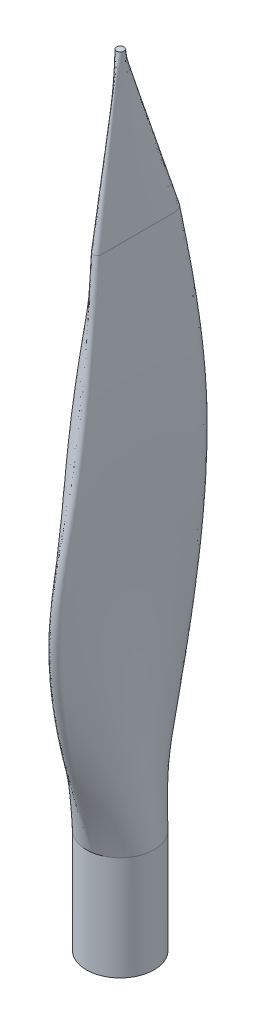
ISO-10303-21;
HEADER;
FILE_DESCRIPTION(('STEP AP214'),'2;1');
FILE_NAME('part.step','',(''),(''),'','','');
FILE_SCHEMA(('AUTOMOTIVE_DESIGN { 1 0 10303 214 1 1 1 1 }'));
ENDSEC;
DATA;
#1=APPLICATION_CONTEXT('core data for automotive mechanical design processes');
#2=APPLICATION_PROTOCOL_DEFINITION('international standard','automotive_design',2000,#1);
#3=PRODUCT_CONTEXT('',#1,'mechanical');
#4=PRODUCT('Part','Part','',(#3));
#5=PRODUCT_RELATED_PRODUCT_CATEGORY('part','',(#4));
#6=PRODUCT_DEFINITION_FORMATION('','',#4);
#7=PRODUCT_DEFINITION_CONTEXT('part definition',#1,'design');
#8=PRODUCT_DEFINITION('design','',#6,#7);
#9=PRODUCT_DEFINITION_SHAPE('','',#8);
#10=(LENGTH_UNIT() NAMED_UNIT(*) SI_UNIT(.MILLI.,.METRE.));
#11=(NAMED_UNIT(*) PLANE_ANGLE_UNIT() SI_UNIT($,.RADIAN.));
#12=(NAMED_UNIT(*) SI_UNIT($,.STERADIAN.) SOLID_ANGLE_UNIT());
#13=UNCERTAINTY_MEASURE_WITH_UNIT(LENGTH_MEASURE(1.E-05),#10,'distance_accuracy_value','');
#14=(GEOMETRIC_REPRESENTATION_CONTEXT(3) GLOBAL_UNCERTAINTY_ASSIGNED_CONTEXT((#13)) GLOBAL_UNIT_ASSIGNED_CONTEXT((#10,
#11,#12)) REPRESENTATION_CONTEXT('',''));
#15=CARTESIAN_POINT('',(0.,0.,0.));
#16=DIRECTION('',(0.,0.,1.));
#17=DIRECTION('',(1.,0.,0.));
#18=AXIS2_PLACEMENT_3D('',#15,#16,#17);
#19=CARTESIAN_POINT('',(0.,25.4,0.));
#20=DIRECTION('',(0.,-1.,0.));
#21=DIRECTION('',(0.,0.,-1.));
#22=AXIS2_PLACEMENT_3D('',#19,#20,#21);
#23=CYLINDRICAL_SURFACE('',#22,8.255);
#24=CARTESIAN_POINT('',(1.80932759033106,25.4,8.05427580052154));
#25=CARTESIAN_POINT('',(2.67978327745344,25.4,7.8587350057359));
#26=CARTESIAN_POINT('',(4.40405834460332,25.4,7.17162650027965));
#27=CARTESIAN_POINT('',(6.58489006832294,25.4,5.25830001659392));
#28=CARTESIAN_POINT('',(8.00372189128558,25.4000000000001,2.65049159237982));
#29=CARTESIAN_POINT('',(8.42313117362764,25.4,-0.295611690758836));
#30=CARTESIAN_POINT('',(7.80713114017676,25.4,-3.14992232382668));
#31=CARTESIAN_POINT('',(6.32180910962537,25.4000000000001,-5.53839029307543));
#32=CARTESIAN_POINT('',(4.25377745083092,25.4,-7.23025019439572));
#33=CARTESIAN_POINT('',(2.69386288098785,25.4,-7.84431519435912));
#34=CARTESIAN_POINT('',(1.58775194501462,25.4,-8.10774402425285));
#35=CARTESIAN_POINT('',(1.09992054255627,25.4,-8.18917968355147));
#36=CARTESIAN_POINT('',(0.470027936961688,25.4,-8.2493608472894));
#37=CARTESIAN_POINT('',(-0.0955518176870434,25.4,-8.2600571099097));
#38=CARTESIAN_POINT('',(-0.640696145279333,25.4,-8.23646633300742));
#39=CARTESIAN_POINT('',(-1.18150648601451,25.4,-8.17567725579651));
#40=CARTESIAN_POINT('',(-1.73657154658257,25.4,-8.0781106803358));
#41=CARTESIAN_POINT('',(-2.34286105201328,25.4,-7.92358184713654));
#42=CARTESIAN_POINT('',(-2.80555345530794,25.4,-7.77018667396729));
#43=CARTESIAN_POINT('',(-3.90348423058681,25.4,-7.32508809915818));
#44=CARTESIAN_POINT('',(-5.45022553650636,25.4,-6.40186993791091));
#45=CARTESIAN_POINT('',(-7.28377189256357,25.4000000000001,-4.22915798099006));
#46=CARTESIAN_POINT('',(-8.30980464907361,25.4,-1.44766247676574));
#47=CARTESIAN_POINT('',(-8.28896624779018,25.4,1.60724893357077));
#48=CARTESIAN_POINT('',(-7.15199149312844,25.4,4.49216296709132));
#49=CARTESIAN_POINT('',(-5.05070886586144,25.4,6.76443468651455));
#50=CARTESIAN_POINT('',(-2.32382514841782,25.4,8.10606055182153));
#51=CARTESIAN_POINT('',(-0.373664870378359,25.4,8.30049478477802));
#52=CARTESIAN_POINT('',(0.648006449935642,25.4,8.22990815233184));
#53=CARTESIAN_POINT('',(0.775179727804014,25.4,8.21938942196944));
#54=CARTESIAN_POINT('',(0.916855966516563,25.4,8.20393176763898));
#55=CARTESIAN_POINT('',(1.05302505401393,25.4,8.18791038456564));
#56=CARTESIAN_POINT('',(1.18696385329334,25.4,8.16996413029657));
#57=CARTESIAN_POINT('',(1.32194922735204,25.4,8.14873186237891));
#58=CARTESIAN_POINT('',(1.45871837180815,25.4,8.12508149695626));
#59=CARTESIAN_POINT('',(1.59800848227982,25.4,8.0998809501722));
#60=CARTESIAN_POINT('',(1.7270931355389,25.4,8.07274910236415));
#61=CARTESIAN_POINT('',(1.80932759033106,25.4,8.05427580052154));
#62=B_SPLINE_CURVE_WITH_KNOTS('',3,(#24,#25,#26,#27,#28,#29,#30,#31,#32,#33,#34,#35,#36,#37,#38,
#39,#40,#41,#42,#43,#44,#45,#46,#47,#48,#49,#50,#51,#52,#53,#54,#55,#56,#57,#58,#59,#60,#61),
.UNSPECIFIED.,.T.,.F.,(4,1,1,1,1,1,1,1,2,1,1,1,1,1,1,1,2,1,1,1,1,1,1,1,2,1,1,1,1,1,1,1,4),(0.,
0.0474035656567812,0.0948071313135626,0.142210696970344,0.189614262627125,0.237017828283906,
0.284421393940688,0.331824959597469,0.37922852525425,0.398930454165107,0.418632383075965,
0.438334311986822,0.458036240897679,0.477738169808536,0.497440098719393,0.517142027630251,
0.536843956541108,0.590260110651673,0.643676264762238,0.697092418872803,0.750508572983368,
0.803924727093933,0.857340881204498,0.910757035315063,0.964173189425628,0.968651540747424,
0.973129892069221,0.977608243391017,0.982086594712814,0.98656494603461,0.991043297356407,
0.995521648678203,1.),.UNSPECIFIED.);
#63=CARTESIAN_POINT('',(1.80932759033106,25.4,8.05427580052154));
#64=VERTEX_POINT('',#63);
#65=EDGE_CURVE('E12',#64,#64,#62,.T.);
#66=ORIENTED_EDGE('',*,*,#65,.F.);
#67=EDGE_LOOP('',(#66));
#68=FACE_BOUND('',#67,.T.);
#69=CARTESIAN_POINT('',(0.,0.,0.));
#70=DIRECTION('',(0.,1.,0.));
#71=DIRECTION('',(0.,0.,1.));
#72=AXIS2_PLACEMENT_3D('',#69,#70,#71);
#73=CIRCLE('',#72,8.255);
#74=CARTESIAN_POINT('',(0.,0.,8.255));
#75=VERTEX_POINT('',#74);
#76=EDGE_CURVE('E337',#75,#75,#73,.T.);
#77=ORIENTED_EDGE('',*,*,#76,.T.);
#78=EDGE_LOOP('',(#77));
#79=FACE_BOUND('',#78,.T.);
#80=ADVANCED_FACE('F327',(#68,#79),#23,.T.);
#81=CARTESIAN_POINT('',(0.,0.,0.));
#82=DIRECTION('',(0.,1.,0.));
#83=DIRECTION('',(0.,0.,1.));
#84=AXIS2_PLACEMENT_3D('',#81,#82,#83);
#85=PLANE('',#84);
#86=ORIENTED_EDGE('',*,*,#76,.F.);
#87=EDGE_LOOP('',(#86));
#88=FACE_BOUND('',#87,.T.);
#89=ADVANCED_FACE('F501',(#88),#85,.F.);
#90=CARTESIAN_POINT('',(3.048,152.4,7.61999999940538));
#91=CARTESIAN_POINT('',(3.97168311158025,137.581726372762,9.93705083523815));
#92=CARTESIAN_POINT('',(5.23320858694252,114.308696250823,12.8048771780018));
#93=CARTESIAN_POINT('',(5.29375091884643,71.9261980239934,23.1651337174881));
#94=CARTESIAN_POINT('',(3.22772954592855,44.2663637223632,13.8288904179118));
#95=CARTESIAN_POINT('',(1.80932759033106,25.4,8.05427580052153));
#96=CARTESIAN_POINT('',(3.048,152.4,7.69377822315741));
#97=CARTESIAN_POINT('',(3.96966035013993,137.581354953724,10.0174954248009));
#98=CARTESIAN_POINT('',(5.2299981479001,114.308520378345,12.9103197773176));
#99=CARTESIAN_POINT('',(5.30425883549053,71.9269283631706,23.309867095451));
#100=CARTESIAN_POINT('',(3.17223412179021,44.2623501151557,13.900336943178));
#101=CARTESIAN_POINT('',(1.7270931355389,25.4,8.07274910236414));
#102=CARTESIAN_POINT('',(3.03284996543065,152.4,7.85713540246196));
#103=CARTESIAN_POINT('',(3.94980473586425,137.580424250727,10.1916731634053));
#104=CARTESIAN_POINT('',(5.19242077040421,114.308202626544,13.059654404207));
#105=CARTESIAN_POINT('',(5.27130855208229,71.9284020126512,23.641442136659));
#106=CARTESIAN_POINT('',(3.09379141282416,44.2541287434281,14.0357445660036));
#107=CARTESIAN_POINT('',(1.59800848227982,25.4,8.09988095017219));
#108=CARTESIAN_POINT('',(2.91482044007338,152.4,8.1701434534786));
#109=CARTESIAN_POINT('',(3.84811678752602,137.574548273565,10.4405257545582));
#110=CARTESIAN_POINT('',(5.1217706733076,114.308996227939,13.2031925918432));
#111=CARTESIAN_POINT('',(5.04580682921654,71.9295893732187,24.1384042981667));
#112=CARTESIAN_POINT('',(2.9199153566371,44.2440298039645,14.2351544480443));
#113=CARTESIAN_POINT('',(1.45871837180815,25.4,8.12508149695625));
#114=CARTESIAN_POINT('',(2.62862325932065,152.4,8.47885349666639));
#115=CARTESIAN_POINT('',(3.65112604535391,137.570023716306,10.6753157842188));
#116=CARTESIAN_POINT('',(5.06882507037544,114.309662921156,13.3070719799318));
#117=CARTESIAN_POINT('',(4.63052156853944,71.930342428506,24.5498224427027));
#118=CARTESIAN_POINT('',(2.6892531645742,44.2370839575759,14.3977832191952));
#119=CARTESIAN_POINT('',(1.32194922735204,25.4,8.1487318623789));
#120=CARTESIAN_POINT('',(2.24956561164877,152.4,8.63814160058633));
#121=CARTESIAN_POINT('',(3.39647581626578,137.569755557536,10.8180126637516));
#122=CARTESIAN_POINT('',(5.01759359345515,114.309518661417,13.4172176537514));
#123=CARTESIAN_POINT('',(4.09049431209239,71.930919824789,24.8014527218704));
#124=CARTESIAN_POINT('',(2.41438563472446,44.2339281258207,14.5048338888274));
#125=CARTESIAN_POINT('',(1.18696385329334,25.4,8.16996413029656));
#126=CARTESIAN_POINT('',(1.83666604137124,152.4,8.64753152033097));
#127=CARTESIAN_POINT('',(3.11286857078359,137.574470745827,10.8756429530747));
#128=CARTESIAN_POINT('',(4.94594521116449,114.308414213725,13.5477482415983));
#129=CARTESIAN_POINT('',(3.49229466016987,71.9313226757487,24.8362419318372));
#130=CARTESIAN_POINT('',(2.11860641714705,44.2350493393417,14.5346278331545));
#131=CARTESIAN_POINT('',(1.05302505401393,25.4,8.18791038456563));
#132=CARTESIAN_POINT('',(1.45248946922749,152.4,8.48250238118353));
#133=CARTESIAN_POINT('',(2.82467126814199,137.583514566891,10.828094571973));
#134=CARTESIAN_POINT('',(4.82295430109227,114.306469732402,13.6928522491202));
#135=CARTESIAN_POINT('',(2.92538656147474,71.9315912946591,24.6649364072667));
#136=CARTESIAN_POINT('',(1.83220688582505,44.2397961496228,14.4924496026579));
#137=CARTESIAN_POINT('',(0.916855966516562,25.4,8.20393176763897));
#138=CARTESIAN_POINT('',(1.22795290414053,152.4,8.25809092741003));
#139=CARTESIAN_POINT('',(2.60042228763511,137.593319302182,10.7380058079384));
#140=CARTESIAN_POINT('',(4.59867015678572,114.304528127488,13.8070149178152));
#141=CARTESIAN_POINT('',(2.49098291387786,71.9313998881605,24.3188582473986));
#142=CARTESIAN_POINT('',(1.57452749469113,44.2474282542082,14.3855426456171));
#143=CARTESIAN_POINT('',(0.775179727804013,25.4,8.21938942196943));
#144=CARTESIAN_POINT('',(1.14805065787373,152.4,8.12570038874196));
#145=CARTESIAN_POINT('',(2.45119534217352,137.596233346646,10.6440185301182));
#146=CARTESIAN_POINT('',(4.3788379823412,114.304218957689,13.8252949399085));
#147=CARTESIAN_POINT('',(2.31630542948646,71.9305663760588,24.0235764561422));
#148=CARTESIAN_POINT('',(1.44159343462687,44.2536968213726,14.2885131525573));
#149=CARTESIAN_POINT('',(0.648006449935641,25.4,8.22990815233183));
#150=CARTESIAN_POINT('',(0.75570198256734,152.4,7.31607262472453));
#151=CARTESIAN_POINT('',(1.5977964825883,137.613311927929,10.0559615996452));
#152=CARTESIAN_POINT('',(2.53350237362381,114.302612672437,13.2855252745979));
#153=CARTESIAN_POINT('',(1.8016061664488,71.9250850346128,22.2529443718681));
#154=CARTESIAN_POINT('',(0.406365657089637,44.293507001201,13.6706499573457));
#155=CARTESIAN_POINT('',(-0.37366487037836,25.4,8.30049478477801));
#156=CARTESIAN_POINT('',(0.0946718340403648,152.4,5.84071096795229));
#157=CARTESIAN_POINT('',(-0.198988633256508,137.606149317206,8.40265708666957));
#158=CARTESIAN_POINT('',(-0.636916623976693,114.308279433511,11.9658553563863));
#159=CARTESIAN_POINT('',(0.88596064562425,71.91290867965,19.0449697522357));
#160=CARTESIAN_POINT('',(-1.04760951232219,44.3513698674302,12.3537848753321));
#161=CARTESIAN_POINT('',(-2.32382514841782,25.4,8.10606055182152));
#162=CARTESIAN_POINT('',(-0.735600151006803,152.4,3.65704382737677));
#163=CARTESIAN_POINT('',(-2.26317954169824,137.611314262259,5.83435974280122));
#164=CARTESIAN_POINT('',(-4.77697083809689,114.309998453016,8.7405354012308));
#165=CARTESIAN_POINT('',(-0.0940885118817747,71.9048592119292,14.6178824220131));
#166=CARTESIAN_POINT('',(-3.32089999272538,44.3963322387879,9.80296756401438));
#167=CARTESIAN_POINT('',(-5.05070886586145,25.4,6.76443468651454));
#168=CARTESIAN_POINT('',(-1.43222965159674,152.4,1.47621174363645));
#169=CARTESIAN_POINT('',(-3.92758699487259,137.605211764494,2.81630991313687));
#170=CARTESIAN_POINT('',(-7.90376941336725,114.313256641385,4.58482948624845));
#171=CARTESIAN_POINT('',(-0.981587325798548,71.8990361064457,10.4542130132672));
#172=CARTESIAN_POINT('',(-5.03329632971325,44.422189329106,6.74260672415038));
#173=CARTESIAN_POINT('',(-7.15199149312844,25.4,4.49216296709132));
#174=CARTESIAN_POINT('',(-2.00305474042763,152.4,-0.721521693234956));
#175=CARTESIAN_POINT('',(-5.02920671646798,137.602529535906,-0.444386453288144));
#176=CARTESIAN_POINT('',(-9.82483231968892,114.315411249088,-0.245714495655292));
#177=CARTESIAN_POINT('',(-1.86781297568134,71.8943820158215,6.4442139183333));
#178=CARTESIAN_POINT('',(-6.1350755744243,44.444343498632,3.33428769140196));
#179=CARTESIAN_POINT('',(-8.28896624779018,25.4,1.60724893357077));
#180=CARTESIAN_POINT('',(-2.45591349019765,152.4,-2.95589289320372));
#181=CARTESIAN_POINT('',(-5.54333303088181,137.604934449843,-3.86146856883915));
#182=CARTESIAN_POINT('',(-10.3937444229804,114.316483945471,-5.4058883509224));
#183=CARTESIAN_POINT('',(-2.82961493017938,71.8898446464626,2.42121622385264));
#184=CARTESIAN_POINT('',(-6.51480780231193,44.4693448130502,-0.199031875958989));
#185=CARTESIAN_POINT('',(-8.30980464907361,25.4,-1.44766247676575));
#186=CARTESIAN_POINT('',(-2.78971411525367,152.4,-5.25005144935452));
#187=CARTESIAN_POINT('',(-5.44771727186078,137.615451843705,-7.31334176461919));
#188=CARTESIAN_POINT('',(-9.57650518697891,114.315335250767,-10.5308333323564));
#189=CARTESIAN_POINT('',(-3.84999992758616,71.8869315216877,-1.79235963711607));
#190=CARTESIAN_POINT('',(-6.23819399534766,44.4914790516474,-3.63092684978925));
#191=CARTESIAN_POINT('',(-7.28377189256358,25.4000000000001,-4.22915798099006));
#192=CARTESIAN_POINT('',(-3.00336482994257,152.4,-7.62714695477207));
#193=CARTESIAN_POINT('',(-4.76108272341757,137.632634638331,-10.6446714565224));
#194=CARTESIAN_POINT('',(-7.4295347268096,114.311287170924,-15.2719768949814));
#195=CARTESIAN_POINT('',(-4.86872603218884,71.8884671731651,-6.35190158898583));
#196=CARTESIAN_POINT('',(-5.34375212967183,44.4952166762149,-6.82070309230426));
#197=CARTESIAN_POINT('',(-5.45022553650636,25.3999999999999,-6.40186993791091));
#198=CARTESIAN_POINT('',(-3.05327670738949,152.4,-9.29892266146442));
#199=CARTESIAN_POINT('',(-3.9456985600277,137.649243774194,-12.8073310063237));
#200=CARTESIAN_POINT('',(-5.22822295373281,114.305694944083,-17.9335853372936));
#201=CARTESIAN_POINT('',(-5.41482349170166,71.8948198951098,-9.73017204455028));
#202=CARTESIAN_POINT('',(-4.62976602332054,44.4737536278063,-8.68022312697193));
#203=CARTESIAN_POINT('',(-3.90348423058681,25.4,-7.32508809915818));
#204=CARTESIAN_POINT('',(-3.05152453620632,152.4,-10.483772367863));
#205=CARTESIAN_POINT('',(-3.27402898321782,137.657946878989,-14.1382754882184));
#206=CARTESIAN_POINT('',(-3.4960288170403,114.301643686965,-19.5552285284041));
#207=CARTESIAN_POINT('',(-5.74954917163259,71.9013983895992,-12.1508049254121));
#208=CARTESIAN_POINT('',(-3.88288251665887,44.445768511333,-9.92534773725531));
#209=CARTESIAN_POINT('',(-2.80555345530794,25.4,-7.77018667396728));
#210=CARTESIAN_POINT('',(-2.95017481811556,152.4,-11.1593386625729));
#211=CARTESIAN_POINT('',(-2.79621313675327,137.66210742133,-14.8548318047083));
#212=CARTESIAN_POINT('',(-2.43436449053018,114.299415944983,-20.2312814314484));
#213=CARTESIAN_POINT('',(-5.65599457656074,71.9053869568694,-13.5643289645063));
#214=CARTESIAN_POINT('',(-3.56586005185774,44.4280444110888,-10.5415273980723));
#215=CARTESIAN_POINT('',(-2.34286105201327,25.4,-7.92358184713654));
#216=CARTESIAN_POINT('',(-2.40027227789121,152.4,-12.1689652599414));
#217=CARTESIAN_POINT('',(-1.7588966365161,137.660474810592,-15.64213952803));
#218=CARTESIAN_POINT('',(-0.675676917175755,114.2978061786,-20.6342095831424));
#219=CARTESIAN_POINT('',(-4.64337055234337,71.9110228653062,-15.6053086070999));
#220=CARTESIAN_POINT('',(-2.73256231181346,44.3979082416063,-11.3848396653549));
#221=CARTESIAN_POINT('',(-1.73657154658257,25.4,-8.07811068033579));
#222=CARTESIAN_POINT('',(-1.40925413849907,152.4,-12.9716188458783));
#223=CARTESIAN_POINT('',(-0.473725574125652,137.653674726298,-16.0804050352248));
#224=CARTESIAN_POINT('',(1.0060895718526,114.297794759591,-20.4603168179556));
#225=CARTESIAN_POINT('',(-2.78571404422093,71.9150925701258,-17.1350558863766));
#226=CARTESIAN_POINT('',(-1.65767590605836,44.3723364824152,-11.9751279368341));
#227=CARTESIAN_POINT('',(-1.18150648601451,25.4,-8.17567725579651));
#228=CARTESIAN_POINT('',(-0.0830069687557917,152.4,-13.3120549401497));
#229=CARTESIAN_POINT('',(0.929992411086743,137.644754945545,-16.0488317600551));
#230=CARTESIAN_POINT('',(2.45805168273842,114.29909068241,-19.8445850939073));
#231=CARTESIAN_POINT('',(-0.396708442770806,71.9166305152768,-17.7586801256953));
#232=CARTESIAN_POINT('',(-0.40898846805068,44.3583684855525,-12.2017728761663));
#233=CARTESIAN_POINT('',(-0.640696145279333,25.4,-8.23646633300742));
#234=CARTESIAN_POINT('',(1.27787244373007,152.4,-13.0374117612226));
#235=CARTESIAN_POINT('',(2.24171512653679,137.637171238719,-15.5115405469324));
#236=CARTESIAN_POINT('',(3.62478968857768,114.301074053256,-18.9244823226268));
#237=CARTESIAN_POINT('',(2.02438530249383,71.9153824151871,-17.3099835972212));
#238=CARTESIAN_POINT('',(0.839739404906433,44.3596565449877,-12.0112193293873));
#239=CARTESIAN_POINT('',(-0.0955518176870446,25.4,-8.2600571099097));
#240=CARTESIAN_POINT('',(2.33744279846333,152.4,-12.2475765459533));
#241=CARTESIAN_POINT('',(3.24968365168173,137.631166979922,-14.5631837140983));
#242=CARTESIAN_POINT('',(4.50249461536489,114.303604801568,-17.7867318735303));
#243=CARTESIAN_POINT('',(3.97385394847938,71.9116098703233,-15.9291999325312));
#244=CARTESIAN_POINT('',(1.91360212223259,44.3750181792033,-11.4607291073964));
#245=CARTESIAN_POINT('',(0.470027936961686,25.4,-8.2493608472894));
#246=CARTESIAN_POINT('',(2.93752052811045,152.4,-11.203552835));
#247=CARTESIAN_POINT('',(3.84912741814383,137.624981547665,-13.3877879326911));
#248=CARTESIAN_POINT('',(5.07645100809808,114.306740038929,-16.4760556890908));
#249=CARTESIAN_POINT('',(5.12329447000906,71.9061924352489,-13.9852895101014));
#250=CARTESIAN_POINT('',(2.75402689252717,44.3987295206361,-10.6652675740491));
#251=CARTESIAN_POINT('',(1.09992054255627,25.4,-8.18917968355146));
#252=CARTESIAN_POINT('',(3.04799999999999,152.4,-10.4946673952408));
#253=CARTESIAN_POINT('',(3.96814228422362,137.619689611612,-12.5587000660699));
#254=CARTESIAN_POINT('',(5.22387079179835,114.309265509483,-15.526034233405));
#255=CARTESIAN_POINT('',(5.32292341271784,71.9020123486266,-12.5918167379491));
#256=CARTESIAN_POINT('',(3.07506740041793,44.4166731777878,-10.0834331849082));
#257=CARTESIAN_POINT('',(1.58775194501462,25.4,-8.10774402425285));
#258=CARTESIAN_POINT('',(3.048,152.4,-9.35477793053567));
#259=CARTESIAN_POINT('',(3.97670590895846,137.610579793457,-11.2006698250624));
#260=CARTESIAN_POINT('',(5.27126076900692,114.313291457218,-13.8821104054559));
#261=CARTESIAN_POINT('',(5.18045461638699,71.8957486562709,-10.346707680953));
#262=CARTESIAN_POINT('',(3.81470200530043,44.4427611148985,-9.01908424950873));
#263=CARTESIAN_POINT('',(2.69386288098784,25.4,-7.84431519435912));
#264=CARTESIAN_POINT('',(3.048,152.4,-7.79232136319472));
#265=CARTESIAN_POINT('',(3.96850319323532,137.597377764932,-9.28435720629213));
#266=CARTESIAN_POINT('',(5.32433992571476,114.318044632025,-11.5551919548377));
#267=CARTESIAN_POINT('',(5.03144534696487,71.8898058836629,-7.2371639325686));
#268=CARTESIAN_POINT('',(4.57666016686645,44.4644221229193,-7.44774753422817));
#269=CARTESIAN_POINT('',(4.25377745083092,25.4,-7.23025019439572));
#270=CARTESIAN_POINT('',(3.048,152.4,-5.54898175825335));
#271=CARTESIAN_POINT('',(3.97242097440411,137.581898270615,-6.48957736337003));
#272=CARTESIAN_POINT('',(5.40463926390504,114.321538948277,-8.02490491602116));
#273=CARTESIAN_POINT('',(4.79632888707788,71.8888645170624,-2.77783847103991));
#274=CARTESIAN_POINT('',(5.79035606274939,44.4587780435224,-4.64837440836168));
#275=CARTESIAN_POINT('',(6.32180910962537,25.4000000000001,-5.53839029307543));
#276=CARTESIAN_POINT('',(3.048,152.4,-3.36236993068896));
#277=CARTESIAN_POINT('',(3.97174489723188,137.571117062234,-3.72786082037402));
#278=CARTESIAN_POINT('',(5.46007994059228,114.3230411201,-4.47962066744949));
#279=CARTESIAN_POINT('',(4.63600559091762,71.8909095013137,1.53765457110411));
#280=CARTESIAN_POINT('',(6.61569260864911,44.4409366033177,-1.49343722052648));
#281=CARTESIAN_POINT('',(7.80713114017677,25.4,-3.14992232382668));
#282=CARTESIAN_POINT('',(3.048,152.4,-1.20735642444523));
#283=CARTESIAN_POINT('',(3.97239332326998,137.565718628521,-0.992580151031468));
#284=CARTESIAN_POINT('',(5.48353670760537,114.323405257906,-0.933327926341549));
#285=CARTESIAN_POINT('',(4.56761862204077,71.8930584183455,5.76037339683394));
#286=CARTESIAN_POINT('',(6.96838042849166,44.4262085753047,1.91119088619829));
#287=CARTESIAN_POINT('',(8.42313117362764,25.4,-0.295611690758839));
#288=CARTESIAN_POINT('',(3.048,152.4,0.941188216534154));
#289=CARTESIAN_POINT('',(3.97143885992435,137.564984821815,1.72509029980058));
#290=CARTESIAN_POINT('',(5.46761777618148,114.323120598389,2.59297547526469));
#291=CARTESIAN_POINT('',(4.61433478682965,71.8943192523562,9.96039100709258));
#292=CARTESIAN_POINT('',(6.72710735255327,44.4192168430985,5.36318524240165));
#293=CARTESIAN_POINT('',(8.00372189128558,25.4,2.65049159237982));
#294=CARTESIAN_POINT('',(3.048,152.4,3.10734764091662));
#295=CARTESIAN_POINT('',(3.97471782636461,137.569553075931,4.45523803754671));
#296=CARTESIAN_POINT('',(5.41417833500179,114.321267754573,6.07051113212648));
#297=CARTESIAN_POINT('',(4.76731132331026,71.8969789536903,14.2162964406797));
#298=CARTESIAN_POINT('',(5.94137695560907,44.4086138489268,8.62074251585487));
#299=CARTESIAN_POINT('',(6.58489006832294,25.4,5.25830001659392));
#300=CARTESIAN_POINT('',(3.048,152.4,5.31520549736959));
#301=CARTESIAN_POINT('',(3.96196128284185,137.572471841739,7.13909296569572));
#302=CARTESIAN_POINT('',(5.33126228666825,114.318089810452,9.49828696062326));
#303=CARTESIAN_POINT('',(5.01526050621042,71.9044593244198,18.5788719326305));
#304=CARTESIAN_POINT('',(4.65559072751634,44.3720623860605,11.5250542098185));
#305=CARTESIAN_POINT('',(4.40405834460332,25.4,7.17162650027965));
#306=CARTESIAN_POINT('',(3.048,152.4,6.83905392743283));
#307=CARTESIAN_POINT('',(3.99309413940145,137.585657861269,9.08554095826342));
#308=CARTESIAN_POINT('',(5.26719123970893,114.310557869521,11.6887621569761));
#309=CARTESIAN_POINT('',(5.18252411220219,71.9184673484276,21.6331239013755));
#310=CARTESIAN_POINT('',(3.81515129843581,44.3088479490599,13.0726254873515));
#311=CARTESIAN_POINT('',(2.67978327745344,25.4,7.8587350057359));
#312=CARTESIAN_POINT('',(3.048,152.4,7.61999999940538));
#313=CARTESIAN_POINT('',(3.97168311158025,137.581726372762,9.93705083523815));
#314=CARTESIAN_POINT('',(5.23320858694252,114.308696250823,12.8048771780018));
#315=CARTESIAN_POINT('',(5.29375091884643,71.9261980239934,23.1651337174881));
#316=CARTESIAN_POINT('',(3.22772954592855,44.2663637223632,13.8288904179118));
#317=CARTESIAN_POINT('',(1.80932759033106,25.4,8.05427580052153));
#318=B_SPLINE_SURFACE_WITH_KNOTS('',3,3,((#90,#91,#92,#93,#94,#95),(#96,#97,#98,#99,#100,#101),
(#102,#103,#104,#105,#106,#107),(#108,#109,#110,#111,#112,#113),(#114,#115,#116,#117,#118,#119),
(#120,#121,#122,#123,#124,#125),(#126,#127,#128,#129,#130,#131),(#132,#133,#134,#135,#136,#137),
(#138,#139,#140,#141,#142,#143),(#144,#145,#146,#147,#148,#149),(#150,#151,#152,#153,#154,#155),
(#156,#157,#158,#159,#160,#161),(#162,#163,#164,#165,#166,#167),(#168,#169,#170,#171,#172,#173),
(#174,#175,#176,#177,#178,#179),(#180,#181,#182,#183,#184,#185),(#186,#187,#188,#189,#190,#191),
(#192,#193,#194,#195,#196,#197),(#198,#199,#200,#201,#202,#203),(#204,#205,#206,#207,#208,#209),
(#210,#211,#212,#213,#214,#215),(#216,#217,#218,#219,#220,#221),(#222,#223,#224,#225,#226,#227),
(#228,#229,#230,#231,#232,#233),(#234,#235,#236,#237,#238,#239),(#240,#241,#242,#243,#244,#245),
(#246,#247,#248,#249,#250,#251),(#252,#253,#254,#255,#256,#257),(#258,#259,#260,#261,#262,#263),
(#264,#265,#266,#267,#268,#269),(#270,#271,#272,#273,#274,#275),(#276,#277,#278,#279,#280,#281),
(#282,#283,#284,#285,#286,#287),(#288,#289,#290,#291,#292,#293),(#294,#295,#296,#297,#298,#299),
(#300,#301,#302,#303,#304,#305),(#306,#307,#308,#309,#310,#311),(#312,#313,#314,#315,#316,
#317)),.UNSPECIFIED.,.T.,.F.,.F.,(4,1,1,1,1,1,1,1,2,1,1,1,1,1,1,1,2,1,1,1,1,1,1,1,2,1,1,1,1,1,1,
1,4),(4,1,1,4),(0.,0.00447835132179653,0.00895670264359306,0.0134350539653896,
0.0179134052871861,0.0223917566089827,0.0268701079307792,0.0313484592525757,0.0358268105743723,
0.0892429646849372,0.142659118795502,0.196075272906067,0.249491427016632,0.302907581127197,
0.356323735237762,0.409739889348327,0.463156043458892,0.482857972369749,0.502559901280607,
0.522261830191464,0.541963759102321,0.561665688013178,0.581367616924035,0.601069545834893,
0.62077147474575,0.668175040402531,0.715578606059312,0.762982171716094,0.810385737372875,
0.857789303029656,0.905192868686437,0.952596434343219,1.),(0.,0.349700606480374,
0.549408268412602,1.),.UNSPECIFIED.);
#319=CARTESIAN_POINT('',(2.032,152.4,7.62));
#320=DIRECTION('',(0.,1.,0.));
#321=DIRECTION('',(0.,0.,-1.));
#322=AXIS2_PLACEMENT_3D('',#319,#320,#321);
#323=CIRCLE('',#322,1.016);
#324=CARTESIAN_POINT('',(1.11770105533342,152.4,8.06307272516098));
#325=VERTEX_POINT('',#324);
#326=CARTESIAN_POINT('',(3.048,152.4,7.62));
#327=VERTEX_POINT('',#326);
#328=EDGE_CURVE('E350',#325,#327,#323,.T.);
#329=CARTESIAN_POINT('',(38.6039577865707,152.4,-10.1029090066302));
#330=DIRECTION('',(0.,1.,0.));
#331=DIRECTION('',(0.,0.,1.));
#332=AXIS2_PLACEMENT_3D('',#329,#330,#331);
#333=CIRCLE('',#332,41.656);
#334=CARTESIAN_POINT('',(-3.05199666500131,152.4,-10.1645103748049));
#335=VERTEX_POINT('',#334);
#336=EDGE_CURVE('E344',#335,#325,#333,.T.);
#337=CARTESIAN_POINT('',(-0.00200000000000113,152.4,-10.16));
#338=DIRECTION('',(0.,1.,0.));
#339=DIRECTION('',(0.,0.,1.));
#340=AXIS2_PLACEMENT_3D('',#337,#338,#339);
#341=CIRCLE('',#340,3.05);
#342=CARTESIAN_POINT('',(3.048,152.4,-10.16));
#343=VERTEX_POINT('',#342);
#344=EDGE_CURVE('E331',#343,#335,#341,.T.);
#345=DIRECTION('',(0.,0.,-1.));
#346=VECTOR('',#345,1.);
#347=CARTESIAN_POINT('',(3.048,152.4,-10.16));
#348=LINE('',#347,#346);
#349=EDGE_CURVE('E371',#327,#343,#348,.T.);
#350=CARTESIAN_POINT('',(0.121550706997581,152.4,5.8456068587161));
#351=CARTESIAN_POINT('',(-0.0938241723689268,137.608800794062,8.38793365760208));
#352=CARTESIAN_POINT('',(-0.534320910263265,114.307149246493,11.7582195100799));
#353=CARTESIAN_POINT('',(0.951530499579384,71.9146111904372,19.1091155187734));
#354=CARTESIAN_POINT('',(-1.0629974667031,44.3443978794325,12.2578649272826));
#355=CARTESIAN_POINT('',(-2.29076569848189,25.4,7.93106479917615));
#356=CARTESIAN_POINT('',(-0.182085494308691,152.4,5.11282192109378));
#357=CARTESIAN_POINT('',(-0.887052269403753,137.607870965557,7.54655797204679));
#358=CARTESIAN_POINT('',(-2.01693469535009,114.308852440013,10.8907487046678));
#359=CARTESIAN_POINT('',(0.559277593122242,71.910225523743,17.5692739754949));
#360=CARTESIAN_POINT('',(-1.80537300578992,44.3663573245494,11.5035124382262));
#361=CARTESIAN_POINT('',(-3.2327863875657,25.4,7.65885193005253));
#362=CARTESIAN_POINT('',(-0.735600151006803,152.4,3.65704382737677));
#363=CARTESIAN_POINT('',(-2.26317954169824,137.611314262259,5.83435974280122));
#364=CARTESIAN_POINT('',(-4.77697083809689,114.309998453016,8.7405354012308));
#365=CARTESIAN_POINT('',(-0.0940885118817747,71.9048592119292,14.6178824220131));
#366=CARTESIAN_POINT('',(-3.32089999272538,44.3963322387879,9.80296756401438));
#367=CARTESIAN_POINT('',(-5.05070886586145,25.4,6.76443468651454));
#368=CARTESIAN_POINT('',(-1.43222965159674,152.4,1.47621174363645));
#369=CARTESIAN_POINT('',(-3.92758699487259,137.605211764494,2.81630991313687));
#370=CARTESIAN_POINT('',(-7.90376941336725,114.313256641385,4.58482948624845));
#371=CARTESIAN_POINT('',(-0.981587325798548,71.8990361064457,10.4542130132672));
#372=CARTESIAN_POINT('',(-5.03329632971325,44.422189329106,6.74260672415038));
#373=CARTESIAN_POINT('',(-7.15199149312844,25.4,4.49216296709132));
#374=CARTESIAN_POINT('',(-2.00305474042763,152.4,-0.721521693234956));
#375=CARTESIAN_POINT('',(-5.02920671646798,137.602529535906,-0.444386453288144));
#376=CARTESIAN_POINT('',(-9.82483231968892,114.315411249088,-0.245714495655292));
#377=CARTESIAN_POINT('',(-1.86781297568134,71.8943820158215,6.4442139183333));
#378=CARTESIAN_POINT('',(-6.1350755744243,44.444343498632,3.33428769140196));
#379=CARTESIAN_POINT('',(-8.28896624779018,25.4,1.60724893357077));
#380=CARTESIAN_POINT('',(-2.45591349019765,152.4,-2.95589289320372));
#381=CARTESIAN_POINT('',(-5.54333303088181,137.604934449843,-3.86146856883915));
#382=CARTESIAN_POINT('',(-10.3937444229804,114.316483945471,-5.4058883509224));
#383=CARTESIAN_POINT('',(-2.82961493017938,71.8898446464626,2.42121622385264));
#384=CARTESIAN_POINT('',(-6.51480780231193,44.4693448130502,-0.199031875958989));
#385=CARTESIAN_POINT('',(-8.30980464907361,25.4,-1.44766247676575));
#386=CARTESIAN_POINT('',(-2.78971411525367,152.4,-5.25005144935452));
#387=CARTESIAN_POINT('',(-5.44771727186078,137.615451843705,-7.31334176461919));
#388=CARTESIAN_POINT('',(-9.57650518697891,114.315335250767,-10.5308333323564));
#389=CARTESIAN_POINT('',(-3.84999992758616,71.8869315216877,-1.79235963711607));
#390=CARTESIAN_POINT('',(-6.23819399534766,44.4914790516474,-3.63092684978925));
#391=CARTESIAN_POINT('',(-7.28377189256358,25.4000000000001,-4.22915798099006));
#392=CARTESIAN_POINT('',(-3.00336482994257,152.4,-7.62714695477207));
#393=CARTESIAN_POINT('',(-4.76108272341757,137.632634638331,-10.6446714565224));
#394=CARTESIAN_POINT('',(-7.4295347268096,114.311287170924,-15.2719768949814));
#395=CARTESIAN_POINT('',(-4.86872603218884,71.8884671731651,-6.35190158898583));
#396=CARTESIAN_POINT('',(-5.34375212967183,44.4952166762149,-6.82070309230426));
#397=CARTESIAN_POINT('',(-5.45022553650636,25.3999999999999,-6.40186993791091));
#398=CARTESIAN_POINT('',(-3.05327670738949,152.4,-9.29892266146442));
#399=CARTESIAN_POINT('',(-3.9456985600277,137.649243774194,-12.8073310063237));
#400=CARTESIAN_POINT('',(-5.22822295373281,114.305694944083,-17.9335853372936));
#401=CARTESIAN_POINT('',(-5.41482349170166,71.8948198951098,-9.73017204455028));
#402=CARTESIAN_POINT('',(-4.62976602332054,44.4737536278063,-8.68022312697193));
#403=CARTESIAN_POINT('',(-3.90348423058681,25.4,-7.32508809915818));
#404=CARTESIAN_POINT('',(-3.05152453620632,152.4,-10.483772367863));
#405=CARTESIAN_POINT('',(-3.27402898321782,137.657946878989,-14.1382754882184));
#406=CARTESIAN_POINT('',(-3.4960288170403,114.301643686965,-19.5552285284041));
#407=CARTESIAN_POINT('',(-5.74954917163259,71.9013983895992,-12.1508049254121));
#408=CARTESIAN_POINT('',(-3.88288251665887,44.445768511333,-9.92534773725531));
#409=CARTESIAN_POINT('',(-2.80555345530794,25.4,-7.77018667396728));
#410=CARTESIAN_POINT('',(-2.95017481811556,152.4,-11.1593386625729));
#411=CARTESIAN_POINT('',(-2.79621313675327,137.66210742133,-14.8548318047083));
#412=CARTESIAN_POINT('',(-2.43436449053018,114.299415944983,-20.2312814314484));
#413=CARTESIAN_POINT('',(-5.65599457656074,71.9053869568694,-13.5643289645063));
#414=CARTESIAN_POINT('',(-3.56586005185774,44.4280444110888,-10.5415273980723));
#415=CARTESIAN_POINT('',(-2.34286105201327,25.4,-7.92358184713654));
#416=CARTESIAN_POINT('',(-2.40027227789121,152.4,-12.1689652599414));
#417=CARTESIAN_POINT('',(-1.7588966365161,137.660474810592,-15.64213952803));
#418=CARTESIAN_POINT('',(-0.675676917175755,114.2978061786,-20.6342095831424));
#419=CARTESIAN_POINT('',(-4.64337055234337,71.9110228653062,-15.6053086070999));
#420=CARTESIAN_POINT('',(-2.73256231181346,44.3979082416063,-11.3848396653549));
#421=CARTESIAN_POINT('',(-1.73657154658257,25.4,-8.07811068033579));
#422=CARTESIAN_POINT('',(-1.40925413849907,152.4,-12.9716188458783));
#423=CARTESIAN_POINT('',(-0.473725574125652,137.653674726298,-16.0804050352248));
#424=CARTESIAN_POINT('',(1.0060895718526,114.297794759591,-20.4603168179556));
#425=CARTESIAN_POINT('',(-2.78571404422093,71.9150925701258,-17.1350558863766));
#426=CARTESIAN_POINT('',(-1.65767590605836,44.3723364824152,-11.9751279368341));
#427=CARTESIAN_POINT('',(-1.18150648601451,25.4,-8.17567725579651));
#428=CARTESIAN_POINT('',(-0.0830069687557917,152.4,-13.3120549401497));
#429=CARTESIAN_POINT('',(0.929992411086743,137.644754945545,-16.0488317600551));
#430=CARTESIAN_POINT('',(2.45805168273842,114.29909068241,-19.8445850939073));
#431=CARTESIAN_POINT('',(-0.396708442770806,71.9166305152768,-17.7586801256953));
#432=CARTESIAN_POINT('',(-0.40898846805068,44.3583684855525,-12.2017728761663));
#433=CARTESIAN_POINT('',(-0.640696145279333,25.4,-8.23646633300742));
#434=CARTESIAN_POINT('',(1.27787244373007,152.4,-13.0374117612226));
#435=CARTESIAN_POINT('',(2.24171512653679,137.637171238719,-15.5115405469324));
#436=CARTESIAN_POINT('',(3.62478968857768,114.301074053256,-18.9244823226268));
#437=CARTESIAN_POINT('',(2.02438530249383,71.9153824151871,-17.3099835972212));
#438=CARTESIAN_POINT('',(0.839739404906433,44.3596565449877,-12.0112193293873));
#439=CARTESIAN_POINT('',(-0.0955518176870446,25.4,-8.2600571099097));
#440=CARTESIAN_POINT('',(2.33744279846333,152.4,-12.2475765459533));
#441=CARTESIAN_POINT('',(3.24968365168173,137.631166979922,-14.5631837140983));
#442=CARTESIAN_POINT('',(4.50249461536489,114.303604801568,-17.7867318735303));
#443=CARTESIAN_POINT('',(3.97385394847938,71.9116098703233,-15.9291999325312));
#444=CARTESIAN_POINT('',(1.91360212223259,44.3750181792033,-11.4607291073964));
#445=CARTESIAN_POINT('',(0.470027936961686,25.4,-8.2493608472894));
#446=CARTESIAN_POINT('',(2.93752052811045,152.4,-11.203552835));
#447=CARTESIAN_POINT('',(3.84912741814383,137.624981547665,-13.3877879326911));
#448=CARTESIAN_POINT('',(5.07645100809808,114.306740038929,-16.4760556890908));
#449=CARTESIAN_POINT('',(5.12329447000906,71.9061924352489,-13.9852895101014));
#450=CARTESIAN_POINT('',(2.75402689252717,44.3987295206361,-10.6652675740491));
#451=CARTESIAN_POINT('',(1.09992054255627,25.4,-8.18917968355146));
#452=CARTESIAN_POINT('',(3.04799999999999,152.4,-10.4946673952408));
#453=CARTESIAN_POINT('',(3.96814228422362,137.619689611612,-12.5587000660699));
#454=CARTESIAN_POINT('',(5.22387079179835,114.309265509483,-15.526034233405));
#455=CARTESIAN_POINT('',(5.32292341271784,71.9020123486266,-12.5918167379491));
#456=CARTESIAN_POINT('',(3.07506740041793,44.4166731777878,-10.0834331849082));
#457=CARTESIAN_POINT('',(1.58775194501462,25.4,-8.10774402425285));
#458=CARTESIAN_POINT('',(3.048,152.4,-9.35477793053567));
#459=CARTESIAN_POINT('',(3.97670590895846,137.610579793457,-11.2006698250624));
#460=CARTESIAN_POINT('',(5.27126076900692,114.313291457218,-13.8821104054559));
#461=CARTESIAN_POINT('',(5.18045461638699,71.8957486562709,-10.346707680953));
#462=CARTESIAN_POINT('',(3.81470200530043,44.4427611148985,-9.01908424950873));
#463=CARTESIAN_POINT('',(2.69386288098784,25.4,-7.84431519435912));
#464=CARTESIAN_POINT('',(3.048,152.4,-7.79232136319472));
#465=CARTESIAN_POINT('',(3.96850319323532,137.597377764932,-9.28435720629213));
#466=CARTESIAN_POINT('',(5.32433992571476,114.318044632025,-11.5551919548377));
#467=CARTESIAN_POINT('',(5.03144534696487,71.8898058836629,-7.2371639325686));
#468=CARTESIAN_POINT('',(4.57666016686645,44.4644221229193,-7.44774753422817));
#469=CARTESIAN_POINT('',(4.25377745083092,25.4,-7.23025019439572));
#470=CARTESIAN_POINT('',(3.048,152.4,-5.54898175825335));
#471=CARTESIAN_POINT('',(3.97242097440411,137.581898270615,-6.48957736337003));
#472=CARTESIAN_POINT('',(5.40463926390504,114.321538948277,-8.02490491602116));
#473=CARTESIAN_POINT('',(4.79632888707788,71.8888645170624,-2.77783847103991));
#474=CARTESIAN_POINT('',(5.79035606274939,44.4587780435224,-4.64837440836168));
#475=CARTESIAN_POINT('',(6.32180910962537,25.4000000000001,-5.53839029307543));
#476=CARTESIAN_POINT('',(3.048,152.4,-3.36236993068896));
#477=CARTESIAN_POINT('',(3.97174489723188,137.571117062234,-3.72786082037402));
#478=CARTESIAN_POINT('',(5.46007994059228,114.3230411201,-4.47962066744949));
#479=CARTESIAN_POINT('',(4.63600559091762,71.8909095013137,1.53765457110411));
#480=CARTESIAN_POINT('',(6.61569260864911,44.4409366033177,-1.49343722052648));
#481=CARTESIAN_POINT('',(7.80713114017677,25.4,-3.14992232382668));
#482=CARTESIAN_POINT('',(3.048,152.4,-1.20735642444523));
#483=CARTESIAN_POINT('',(3.97239332326998,137.565718628521,-0.992580151031468));
#484=CARTESIAN_POINT('',(5.48353670760537,114.323405257906,-0.933327926341549));
#485=CARTESIAN_POINT('',(4.56761862204077,71.8930584183455,5.76037339683394));
#486=CARTESIAN_POINT('',(6.96838042849166,44.4262085753047,1.91119088619829));
#487=CARTESIAN_POINT('',(8.42313117362764,25.4,-0.295611690758839));
#488=CARTESIAN_POINT('',(3.048,152.4,0.941188216534154));
#489=CARTESIAN_POINT('',(3.97143885992435,137.564984821815,1.72509029980058));
#490=CARTESIAN_POINT('',(5.46761777618148,114.323120598389,2.59297547526469));
#491=CARTESIAN_POINT('',(4.61433478682965,71.8943192523562,9.96039100709258));
#492=CARTESIAN_POINT('',(6.72710735255327,44.4192168430985,5.36318524240165));
#493=CARTESIAN_POINT('',(8.00372189128558,25.4,2.65049159237982));
#494=CARTESIAN_POINT('',(3.048,152.4,3.10734764091662));
#495=CARTESIAN_POINT('',(3.97471782636461,137.569553075931,4.45523803754671));
#496=CARTESIAN_POINT('',(5.41417833500179,114.321267754573,6.07051113212648));
#497=CARTESIAN_POINT('',(4.76731132331026,71.8969789536903,14.2162964406797));
#498=CARTESIAN_POINT('',(5.94137695560907,44.4086138489268,8.62074251585487));
#499=CARTESIAN_POINT('',(6.58489006832294,25.4,5.25830001659392));
#500=CARTESIAN_POINT('',(3.048,152.4,5.31520549736959));
#501=CARTESIAN_POINT('',(3.96196128284185,137.572471841739,7.13909296569572));
#502=CARTESIAN_POINT('',(5.33126228666825,114.318089810452,9.49828696062326));
#503=CARTESIAN_POINT('',(5.01526050621042,71.9044593244198,18.5788719326305));
#504=CARTESIAN_POINT('',(4.65559072751634,44.3720623860605,11.5250542098185));
#505=CARTESIAN_POINT('',(4.40405834460332,25.4,7.17162650027965));
#506=CARTESIAN_POINT('',(3.048,152.4,6.83905392743283));
#507=CARTESIAN_POINT('',(3.99309413940145,137.585657861269,9.08554095826342));
#508=CARTESIAN_POINT('',(5.26719123970893,114.310557869521,11.6887621569761));
#509=CARTESIAN_POINT('',(5.18252411220219,71.9184673484276,21.6331239013755));
#510=CARTESIAN_POINT('',(3.81515129843581,44.3088479490599,13.0726254873515));
#511=CARTESIAN_POINT('',(2.67978327745344,25.4,7.8587350057359));
#512=CARTESIAN_POINT('',(3.048,152.4,7.69377822315741));
#513=CARTESIAN_POINT('',(3.96966035013993,137.581354953724,10.0174954248009));
#514=CARTESIAN_POINT('',(5.2299981479001,114.308520378345,12.9103197773176));
#515=CARTESIAN_POINT('',(5.30425883549053,71.9269283631706,23.309867095451));
#516=CARTESIAN_POINT('',(3.17223412179021,44.2623501151557,13.900336943178));
#517=CARTESIAN_POINT('',(1.7270931355389,25.4,8.07274910236414));
#518=CARTESIAN_POINT('',(3.03284996543065,152.4,7.85713540246196));
#519=CARTESIAN_POINT('',(3.94980473586425,137.580424250727,10.1916731634053));
#520=CARTESIAN_POINT('',(5.19242077040421,114.308202626544,13.059654404207));
#521=CARTESIAN_POINT('',(5.27130855208229,71.9284020126512,23.641442136659));
#522=CARTESIAN_POINT('',(3.09379141282416,44.2541287434281,14.0357445660036));
#523=CARTESIAN_POINT('',(1.59800848227982,25.4,8.09988095017219));
#524=CARTESIAN_POINT('',(2.91482044007338,152.4,8.1701434534786));
#525=CARTESIAN_POINT('',(3.84811678752602,137.574548273565,10.4405257545582));
#526=CARTESIAN_POINT('',(5.1217706733076,114.308996227939,13.2031925918432));
#527=CARTESIAN_POINT('',(5.04580682921654,71.9295893732187,24.1384042981667));
#528=CARTESIAN_POINT('',(2.9199153566371,44.2440298039645,14.2351544480443));
#529=CARTESIAN_POINT('',(1.45871837180815,25.4,8.12508149695625));
#530=CARTESIAN_POINT('',(2.62862325932065,152.4,8.47885349666639));
#531=CARTESIAN_POINT('',(3.65112604535391,137.570023716306,10.6753157842188));
#532=CARTESIAN_POINT('',(5.06882507037544,114.309662921156,13.3070719799318));
#533=CARTESIAN_POINT('',(4.63052156853944,71.930342428506,24.5498224427027));
#534=CARTESIAN_POINT('',(2.6892531645742,44.2370839575759,14.3977832191952));
#535=CARTESIAN_POINT('',(1.32194922735204,25.4,8.1487318623789));
#536=CARTESIAN_POINT('',(2.24956561164877,152.4,8.63814160058633));
#537=CARTESIAN_POINT('',(3.39647581626578,137.569755557536,10.8180126637516));
#538=CARTESIAN_POINT('',(5.01759359345515,114.309518661417,13.4172176537514));
#539=CARTESIAN_POINT('',(4.09049431209239,71.930919824789,24.8014527218704));
#540=CARTESIAN_POINT('',(2.41438563472446,44.2339281258207,14.5048338888274));
#541=CARTESIAN_POINT('',(1.18696385329334,25.4,8.16996413029656));
#542=CARTESIAN_POINT('',(1.83666604137124,152.4,8.64753152033097));
#543=CARTESIAN_POINT('',(3.11286857078359,137.574470745827,10.8756429530747));
#544=CARTESIAN_POINT('',(4.94594521116449,114.308414213725,13.5477482415983));
#545=CARTESIAN_POINT('',(3.49229466016987,71.9313226757487,24.8362419318372));
#546=CARTESIAN_POINT('',(2.11860641714705,44.2350493393417,14.5346278331545));
#547=CARTESIAN_POINT('',(1.05302505401393,25.4,8.18791038456563));
#548=CARTESIAN_POINT('',(1.45248946922749,152.4,8.48250238118353));
#549=CARTESIAN_POINT('',(2.82467126814199,137.583514566891,10.828094571973));
#550=CARTESIAN_POINT('',(4.82295430109227,114.306469732402,13.6928522491202));
#551=CARTESIAN_POINT('',(2.92538656147474,71.9315912946591,24.6649364072667));
#552=CARTESIAN_POINT('',(1.83220688582505,44.2397961496228,14.4924496026579));
#553=CARTESIAN_POINT('',(0.916855966516562,25.4,8.20393176763897));
#554=CARTESIAN_POINT('',(1.22795290414053,152.4,8.25809092741003));
#555=CARTESIAN_POINT('',(2.60042228763511,137.593319302182,10.7380058079384));
#556=CARTESIAN_POINT('',(4.59867015678572,114.304528127488,13.8070149178152));
#557=CARTESIAN_POINT('',(2.49098291387786,71.9313998881605,24.3188582473986));
#558=CARTESIAN_POINT('',(1.57452749469113,44.2474282542082,14.3855426456171));
#559=CARTESIAN_POINT('',(0.775179727804013,25.4,8.21938942196943));
#560=CARTESIAN_POINT('',(1.14805065787373,152.4,8.12570038874196));
#561=CARTESIAN_POINT('',(2.45119534217352,137.596233346646,10.6440185301182));
#562=CARTESIAN_POINT('',(4.3788379823412,114.304218957689,13.8252949399085));
#563=CARTESIAN_POINT('',(2.31630542948646,71.9305663760588,24.0235764561422));
#564=CARTESIAN_POINT('',(1.44159343462687,44.2536968213726,14.2885131525573));
#565=CARTESIAN_POINT('',(0.648006449935641,25.4,8.22990815233183));
#566=CARTESIAN_POINT('',(0.75570198256734,152.4,7.31607262472453));
#567=CARTESIAN_POINT('',(1.5977964825883,137.613311927929,10.0559615996452));
#568=CARTESIAN_POINT('',(2.53350237362381,114.302612672437,13.2855252745979));
#569=CARTESIAN_POINT('',(1.8016061664488,71.9250850346128,22.2529443718681));
#570=CARTESIAN_POINT('',(0.406365657089637,44.293507001201,13.6706499573457));
#571=CARTESIAN_POINT('',(-0.37366487037836,25.4,8.30049478477801));
#572=CARTESIAN_POINT('',(0.425186908303852,152.4,6.57839179633841));
#573=CARTESIAN_POINT('',(0.699403924665896,137.609730622567,9.22930934315736));
#574=CARTESIAN_POINT('',(0.948292874823557,114.305446052974,12.6256903154921));
#575=CARTESIAN_POINT('',(1.34378340603652,71.9189968571314,20.6489570620519));
#576=CARTESIAN_POINT('',(-0.320621927616278,44.3224384343156,13.0122174163389));
#577=CARTESIAN_POINT('',(-1.34874500939809,25.4,8.20327766829976));
#578=CARTESIAN_POINT('',(0.121550706997581,152.4,5.8456068587161));
#579=CARTESIAN_POINT('',(-0.0938241723689268,137.608800794062,8.38793365760208));
#580=CARTESIAN_POINT('',(-0.534320910263265,114.307149246493,11.7582195100799));
#581=CARTESIAN_POINT('',(0.951530499579384,71.9146111904372,19.1091155187734));
#582=CARTESIAN_POINT('',(-1.0629974667031,44.3443978794325,12.2578649272826));
#583=CARTESIAN_POINT('',(-2.29076569848189,25.4,7.93106479917615));
#584=B_SPLINE_SURFACE_WITH_KNOTS('',3,3,((#350,#351,#352,#353,#354,#355),(#356,#357,#358,#359,
#360,#361),(#362,#363,#364,#365,#366,#367),(#368,#369,#370,#371,#372,#373),(#374,#375,#376,#377,
#378,#379),(#380,#381,#382,#383,#384,#385),(#386,#387,#388,#389,#390,#391),(#392,#393,#394,#395,
#396,#397),(#398,#399,#400,#401,#402,#403),(#404,#405,#406,#407,#408,#409),(#410,#411,#412,#413,
#414,#415),(#416,#417,#418,#419,#420,#421),(#422,#423,#424,#425,#426,#427),(#428,#429,#430,#431,
#432,#433),(#434,#435,#436,#437,#438,#439),(#440,#441,#442,#443,#444,#445),(#446,#447,#448,#449,
#450,#451),(#452,#453,#454,#455,#456,#457),(#458,#459,#460,#461,#462,#463),(#464,#465,#466,#467,
#468,#469),(#470,#471,#472,#473,#474,#475),(#476,#477,#478,#479,#480,#481),(#482,#483,#484,#485,
#486,#487),(#488,#489,#490,#491,#492,#493),(#494,#495,#496,#497,#498,#499),(#500,#501,#502,#503,
#504,#505),(#506,#507,#508,#509,#510,#511),(#512,#513,#514,#515,#516,#517),(#518,#519,#520,#521,
#522,#523),(#524,#525,#526,#527,#528,#529),(#530,#531,#532,#533,#534,#535),(#536,#537,#538,#539,
#540,#541),(#542,#543,#544,#545,#546,#547),(#548,#549,#550,#551,#552,#553),(#554,#555,#556,#557,
#558,#559),(#560,#561,#562,#563,#564,#565),(#566,#567,#568,#569,#570,#571),(#572,#573,#574,#575,
#576,#577),(#578,#579,#580,#581,#582,#583)),.UNSPECIFIED.,.T.,.F.,.F.,(4,1,1,1,1,1,1,2,1,1,1,1,
1,1,1,2,1,1,1,1,1,1,1,2,1,1,1,1,1,1,1,2,4),(4,1,1,4),(0.0892429646849372,0.142659118795502,
0.196075272906067,0.249491427016632,0.302907581127197,0.356323735237762,0.409739889348327,
0.463156043458892,0.482857972369749,0.502559901280607,0.522261830191464,0.541963759102321,
0.561665688013178,0.581367616924035,0.601069545834893,0.62077147474575,0.668175040402531,
0.715578606059312,0.762982171716094,0.810385737372875,0.857789303029656,0.905192868686437,
0.952596434343219,1.,1.0044783513218,1.00895670264359,1.01343505396539,1.01791340528719,
1.02239175660898,1.02687010793078,1.03134845925258,1.03582681057437,1.08924296468494),(0.,
0.349700606480374,0.549408268412602,1.),.UNSPECIFIED.);
#585=ORIENTED_EDGE('',*,*,#328,.F.);
#586=ORIENTED_EDGE('',*,*,#336,.F.);
#587=ORIENTED_EDGE('',*,*,#344,.F.);
#588=ORIENTED_EDGE('',*,*,#349,.F.);
#589=EDGE_LOOP('',(#585,#586,#587,#588));
#590=FACE_BOUND('',#589,.T.);
#591=ORIENTED_EDGE('',*,*,#65,.T.);
#592=EDGE_LOOP('',(#591));
#593=FACE_BOUND('',#592,.T.);
#594=ADVANCED_FACE('F369',(#590,#593),#584,.T.);
#595=CARTESIAN_POINT('',(0.,190.5,0.));
#596=DIRECTION('',(0.,1.,0.));
#597=DIRECTION('',(0.,0.,1.));
#598=AXIS2_PLACEMENT_3D('',#595,#596,#597);
#599=PLANE('',#598);
#600=CARTESIAN_POINT('',(0.,190.5,0.));
#601=DIRECTION('',(0.,1.,0.));
#602=DIRECTION('',(0.,0.,1.));
#603=AXIS2_PLACEMENT_3D('',#600,#601,#602);
#604=CIRCLE('',#603,0.9);
#605=CARTESIAN_POINT('',(0.521457708966028,190.5,0.733540631294478));
#606=VERTEX_POINT('',#605);
#607=CARTESIAN_POINT('',(-0.135206732012279,190.5,-0.889786007767351));
#608=VERTEX_POINT('',#607);
#609=EDGE_CURVE('E375',#606,#608,#604,.T.);
#610=ORIENTED_EDGE('',*,*,#609,.T.);
#611=CARTESIAN_POINT('',(-0.655271103323432,190.5,-0.616943904378098));
#612=VERTEX_POINT('',#611);
#613=EDGE_CURVE('E464',#608,#612,#604,.T.);
#614=ORIENTED_EDGE('',*,*,#613,.T.);
#615=CARTESIAN_POINT('',(0.356715629433537,190.5,0.826289271210655));
#616=VERTEX_POINT('',#615);
#617=EDGE_CURVE('E467',#612,#616,#604,.T.);
#618=ORIENTED_EDGE('',*,*,#617,.T.);
#619=EDGE_CURVE('E444',#616,#606,#604,.T.);
#620=ORIENTED_EDGE('',*,*,#619,.T.);
#621=EDGE_LOOP('',(#610,#614,#618,#620));
#622=FACE_BOUND('',#621,.T.);
#623=ADVANCED_FACE('F398',(#622),#599,.T.);
#624=CARTESIAN_POINT('',(3.048,152.4,7.61999999927415));
#625=CARTESIAN_POINT('',(0.521457708900474,190.5,0.733540631341079));
#626=CARTESIAN_POINT('',(3.048,152.4,6.08444314990321));
#627=CARTESIAN_POINT('',(0.679865566989758,190.5,0.620932010581129));
#628=CARTESIAN_POINT('',(3.048,152.4,3.14948093963747));
#629=CARTESIAN_POINT('',(0.935265189126141,190.5,0.277076305905932));
#630=CARTESIAN_POINT('',(3.048,152.4,-1.11678368585756));
#631=CARTESIAN_POINT('',(0.894770466745471,190.5,-0.3927089077823));
#632=CARTESIAN_POINT('',(3.048,152.4,-5.44290526614857));
#633=CARTESIAN_POINT('',(0.440583623056577,190.5,-0.862572486133492));
#634=CARTESIAN_POINT('',(3.048,152.4,-8.51052731203314));
#635=CARTESIAN_POINT('',(0.0439316267947967,190.5,-0.917006835989995));
#636=CARTESIAN_POINT('',(3.04799999999999,152.4,-10.4751531208774));
#637=CARTESIAN_POINT('',(-0.169433435924769,190.5,-0.884585115931378));
#638=CARTESIAN_POINT('',(2.95047541685728,152.4,-11.1460207813442));
#639=CARTESIAN_POINT('',(-0.227240773464104,190.5,-0.87252134233148));
#640=CARTESIAN_POINT('',(2.4020643274862,152.4,-12.1654555756731));
#641=CARTESIAN_POINT('',(-0.29559012012126,190.5,-0.850603475491913));
#642=CARTESIAN_POINT('',(1.38900562627045,152.4,-12.9855285618903));
#643=CARTESIAN_POINT('',(-0.359154358331671,190.5,-0.826027165556766));
#644=CARTESIAN_POINT('',(0.0195556459920121,152.4,-13.318571820211));
#645=CARTESIAN_POINT('',(-0.419024294445959,190.5,-0.797713357346522));
#646=CARTESIAN_POINT('',(-1.35914164648475,152.4,-13.003397966295));
#647=CARTESIAN_POINT('',(-0.476290734814746,190.5,-0.764582995681663));
#648=CARTESIAN_POINT('',(-2.38979805367843,152.4,-12.1872995754863));
#649=CARTESIAN_POINT('',(-0.532526641489366,190.5,-0.726260117224638));
#650=CARTESIAN_POINT('',(-2.95094444263887,152.4,-11.1607443410221));
#651=CARTESIAN_POINT('',(-0.589304976521154,190.5,-0.682368758637897));
#652=CARTESIAN_POINT('',(-3.05152581944743,152.4,-10.4829046171176));
#653=CARTESIAN_POINT('',(-0.631796298124022,190.5,-0.641877065066064));
#654=CARTESIAN_POINT('',(-3.05455931625986,152.4,-8.43159944665485));
#655=CARTESIAN_POINT('',(-0.783036438272074,190.5,-0.481241239347834));
#656=CARTESIAN_POINT('',(-2.84865398553587,152.4,-5.18540645102316));
#657=CARTESIAN_POINT('',(-0.965356363704033,190.5,-0.112074384222536));
#658=CARTESIAN_POINT('',(-2.05002689622073,152.4,-0.648000877809646));
#659=CARTESIAN_POINT('',(-0.818072867089128,190.5,0.540177849176287));
#660=CARTESIAN_POINT('',(-0.780245609176457,152.4,3.71872703544841));
#661=CARTESIAN_POINT('',(-0.263130413754907,190.5,0.942502096426674));
#662=CARTESIAN_POINT('',(0.410064869616544,152.4,6.60283610697342));
#663=CARTESIAN_POINT('',(0.173902946977948,190.5,0.905210955616689));
#664=CARTESIAN_POINT('',(1.15623163788518,152.4,8.14258218029884));
#665=CARTESIAN_POINT('',(0.366669726269313,190.5,0.821992008687793));
#666=CARTESIAN_POINT('',(1.25923817393392,152.4,8.30264912070493));
#667=CARTESIAN_POINT('',(0.383582342262185,190.5,0.814339358535023));
#668=CARTESIAN_POINT('',(1.51075214987121,152.4,8.5153400990405));
#669=CARTESIAN_POINT('',(0.403869703210495,190.5,0.804346124703879));
#670=CARTESIAN_POINT('',(1.86347861542738,152.4,8.64773378482571));
#671=CARTESIAN_POINT('',(0.422980671112848,190.5,0.794498748989897));
#672=CARTESIAN_POINT('',(2.27435245106539,152.4,8.63535798041051));
#673=CARTESIAN_POINT('',(0.441380754452358,190.5,0.784468746563981));
#674=CARTESIAN_POINT('',(2.64417511558922,152.4,8.46181583309313));
#675=CARTESIAN_POINT('',(0.459535461712136,190.5,0.773927632597032));
#676=CARTESIAN_POINT('',(2.89659334002672,152.4,8.18960264086914));
#677=CARTESIAN_POINT('',(0.477925396787973,190.5,0.762672978352011));
#678=CARTESIAN_POINT('',(3.0258443535834,152.4,7.89277020062285));
#679=CARTESIAN_POINT('',(0.497031163575658,190.5,0.750502355091875));
#680=CARTESIAN_POINT('',(3.048,152.4,7.70694587056003));
#681=CARTESIAN_POINT('',(0.512488383378111,190.5,0.739916725231895));
#682=CARTESIAN_POINT('',(3.048,152.4,7.61999999927415));
#683=CARTESIAN_POINT('',(0.521457708900474,190.5,0.733540631341079));
#684=B_SPLINE_SURFACE_WITH_KNOTS('',3,1,((#624,#625),(#626,#627),(#628,#629),(#630,#631),(#632,
#633),(#634,#635),(#636,#637),(#638,#639),(#640,#641),(#642,#643),(#644,#645),(#646,#647),(#648,
#649),(#650,#651),(#652,#653),(#654,#655),(#656,#657),(#658,#659),(#660,#661),(#662,#663),(#664,
#665),(#666,#667),(#668,#669),(#670,#671),(#672,#673),(#674,#675),(#676,#677),(#678,#679),(#680,
#681),(#682,#683)),.UNSPECIFIED.,.T.,.F.,.F.,(4,1,1,1,2,1,1,1,1,1,1,1,2,1,1,1,2,1,1,1,1,1,1,1,
4),(2,2),(0.,0.098609229257314,0.197218458514628,0.295827687771942,0.394436917029256,
0.413277487608195,0.432118058187134,0.450958628766073,0.469799199345012,0.48863976992395,
0.507480340502889,0.526320911081828,0.545161481660767,0.647704262739617,0.750247043818467,
0.852789824897318,0.955332605976168,0.960916030229147,0.966499454482126,0.972082878735105,
0.977666302988084,0.983249727241063,0.988833151494042,0.994416575747021,1.),(0.,1.),.UNSPECIFIED.);
#685=ORIENTED_EDGE('',*,*,#349,.T.);
#686=ORIENTED_EDGE('',*,*,#344,.T.);
#687=ORIENTED_EDGE('',*,*,#336,.T.);
#688=ORIENTED_EDGE('',*,*,#328,.T.);
#689=EDGE_LOOP('',(#685,#686,#687,#688));
#690=FACE_BOUND('',#689,.T.);
#691=ORIENTED_EDGE('',*,*,#619,.F.);
#692=ORIENTED_EDGE('',*,*,#617,.F.);
#693=ORIENTED_EDGE('',*,*,#613,.F.);
#694=ORIENTED_EDGE('',*,*,#609,.F.);
#695=EDGE_LOOP('',(#691,#692,#693,#694));
#696=FACE_BOUND('',#695,.T.);
#697=ADVANCED_FACE('F379',(#690,#696),#684,.T.);
#698=CLOSED_SHELL('',(#80,#89,#594,#623,#697));
#699=MANIFOLD_SOLID_BREP('B2',#698);
#700=ADVANCED_BREP_SHAPE_REPRESENTATION('',(#18,#699),#14);
#701=SHAPE_DEFINITION_REPRESENTATION(#9,#700);
ENDSEC;
END-ISO-10303-21;
